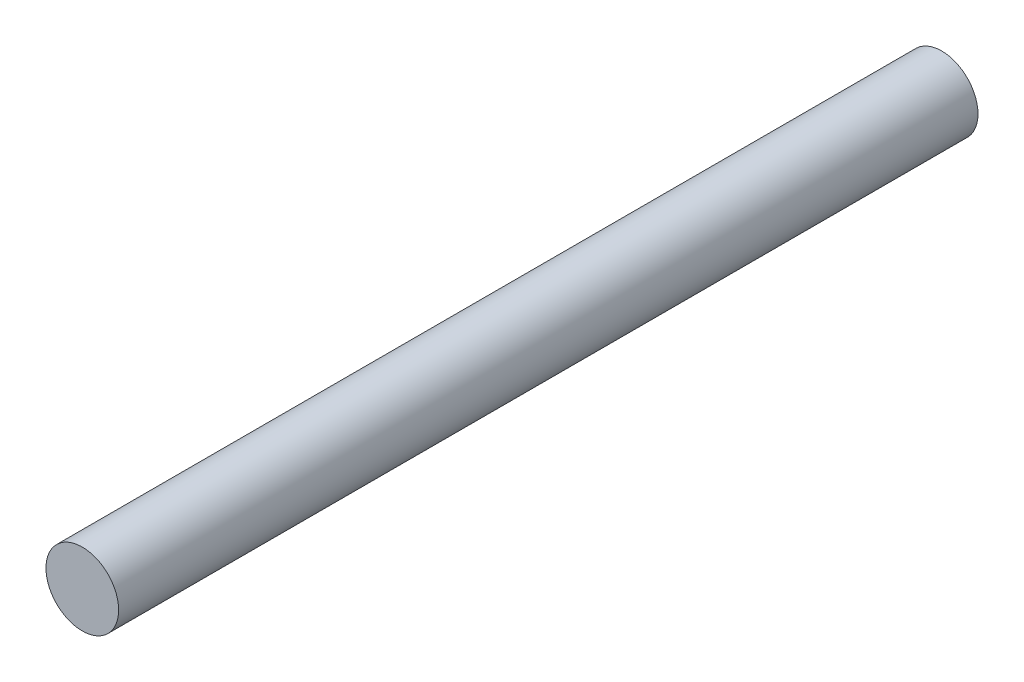
ISO-10303-21;
HEADER;
FILE_DESCRIPTION(('STEP AP214'),'2;1');
FILE_NAME('part.step','',(''),(''),'','','');
FILE_SCHEMA(('AUTOMOTIVE_DESIGN { 1 0 10303 214 1 1 1 1 }'));
ENDSEC;
DATA;
#1=APPLICATION_CONTEXT('core data for automotive mechanical design processes');
#2=APPLICATION_PROTOCOL_DEFINITION('international standard','automotive_design',2000,#1);
#3=PRODUCT_CONTEXT('',#1,'mechanical');
#4=PRODUCT('Part','Part','',(#3));
#5=PRODUCT_RELATED_PRODUCT_CATEGORY('part','',(#4));
#6=PRODUCT_DEFINITION_FORMATION('','',#4);
#7=PRODUCT_DEFINITION_CONTEXT('part definition',#1,'design');
#8=PRODUCT_DEFINITION('design','',#6,#7);
#9=PRODUCT_DEFINITION_SHAPE('','',#8);
#10=(LENGTH_UNIT() NAMED_UNIT(*) SI_UNIT(.MILLI.,.METRE.));
#11=(NAMED_UNIT(*) PLANE_ANGLE_UNIT() SI_UNIT($,.RADIAN.));
#12=(NAMED_UNIT(*) SI_UNIT($,.STERADIAN.) SOLID_ANGLE_UNIT());
#13=UNCERTAINTY_MEASURE_WITH_UNIT(LENGTH_MEASURE(1.E-05),#10,'distance_accuracy_value','');
#14=(GEOMETRIC_REPRESENTATION_CONTEXT(3) GLOBAL_UNCERTAINTY_ASSIGNED_CONTEXT((#13)) GLOBAL_UNIT_ASSIGNED_CONTEXT((#10,
#11,#12)) REPRESENTATION_CONTEXT('',''));
#15=CARTESIAN_POINT('',(0.,0.,0.));
#16=DIRECTION('',(0.,0.,1.));
#17=DIRECTION('',(1.,0.,0.));
#18=AXIS2_PLACEMENT_3D('',#15,#16,#17);
#19=CARTESIAN_POINT('',(0.,0.,260.));
#20=DIRECTION('',(0.,0.,-1.));
#21=DIRECTION('',(-1.,0.,0.));
#22=AXIS2_PLACEMENT_3D('',#19,#20,#21);
#23=CYLINDRICAL_SURFACE('',#22,11.);
#24=CARTESIAN_POINT('',(0.,0.,260.));
#25=DIRECTION('',(0.,0.,1.));
#26=DIRECTION('',(1.,0.,0.));
#27=AXIS2_PLACEMENT_3D('',#24,#25,#26);
#28=CIRCLE('',#27,11.);
#29=CARTESIAN_POINT('',(11.,0.,260.));
#30=VERTEX_POINT('',#29);
#31=EDGE_CURVE('E10',#30,#30,#28,.T.);
#32=ORIENTED_EDGE('',*,*,#31,.F.);
#33=EDGE_LOOP('',(#32));
#34=FACE_BOUND('',#33,.T.);
#35=CARTESIAN_POINT('',(0.,0.,0.));
#36=DIRECTION('',(0.,0.,1.));
#37=DIRECTION('',(1.,0.,0.));
#38=AXIS2_PLACEMENT_3D('',#35,#36,#37);
#39=CIRCLE('',#38,11.);
#40=CARTESIAN_POINT('',(11.,0.,0.));
#41=VERTEX_POINT('',#40);
#42=EDGE_CURVE('E45',#41,#41,#39,.T.);
#43=ORIENTED_EDGE('',*,*,#42,.T.);
#44=EDGE_LOOP('',(#43));
#45=FACE_BOUND('',#44,.T.);
#46=ADVANCED_FACE('F39',(#34,#45),#23,.T.);
#47=CARTESIAN_POINT('',(0.,0.,260.));
#48=DIRECTION('',(0.,0.,1.));
#49=DIRECTION('',(1.,0.,0.));
#50=AXIS2_PLACEMENT_3D('',#47,#48,#49);
#51=PLANE('',#50);
#52=ORIENTED_EDGE('',*,*,#31,.T.);
#53=EDGE_LOOP('',(#52));
#54=FACE_BOUND('',#53,.T.);
#55=ADVANCED_FACE('F53',(#54),#51,.T.);
#56=CARTESIAN_POINT('',(0.,0.,0.));
#57=DIRECTION('',(0.,0.,1.));
#58=DIRECTION('',(1.,0.,0.));
#59=AXIS2_PLACEMENT_3D('',#56,#57,#58);
#60=PLANE('',#59);
#61=ORIENTED_EDGE('',*,*,#42,.F.);
#62=EDGE_LOOP('',(#61));
#63=FACE_BOUND('',#62,.T.);
#64=ADVANCED_FACE('F55',(#63),#60,.F.);
#65=CLOSED_SHELL('',(#46,#55,#64));
#66=MANIFOLD_SOLID_BREP('B2',#65);
#67=ADVANCED_BREP_SHAPE_REPRESENTATION('',(#18,#66),#14);
#68=SHAPE_DEFINITION_REPRESENTATION(#9,#67);
ENDSEC;
END-ISO-10303-21;
